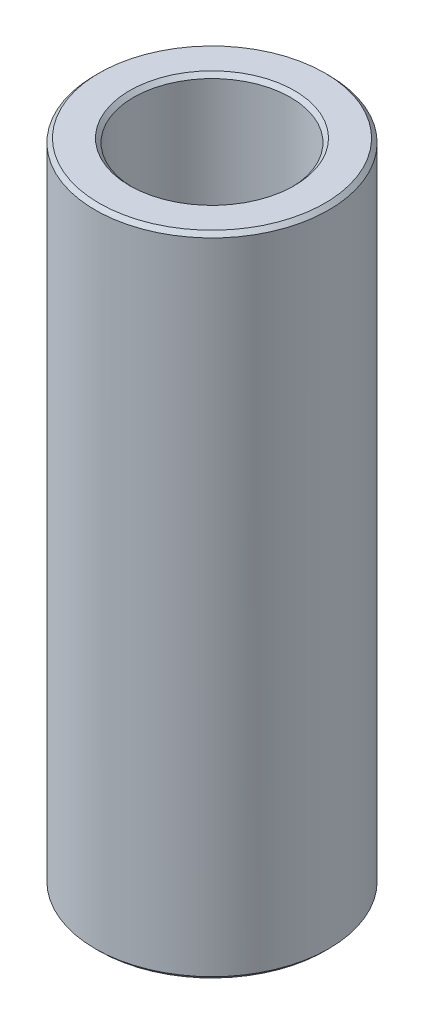
ISO-10303-21;
HEADER;
FILE_DESCRIPTION(('STEP AP214'),'2;1');
FILE_NAME('part.step','',(''),(''),'','','');
FILE_SCHEMA(('AUTOMOTIVE_DESIGN { 1 0 10303 214 1 1 1 1 }'));
ENDSEC;
DATA;
#1=APPLICATION_CONTEXT('core data for automotive mechanical design processes');
#2=APPLICATION_PROTOCOL_DEFINITION('international standard','automotive_design',2000,#1);
#3=PRODUCT_CONTEXT('',#1,'mechanical');
#4=PRODUCT('Part','Part','',(#3));
#5=PRODUCT_RELATED_PRODUCT_CATEGORY('part','',(#4));
#6=PRODUCT_DEFINITION_FORMATION('','',#4);
#7=PRODUCT_DEFINITION_CONTEXT('part definition',#1,'design');
#8=PRODUCT_DEFINITION('design','',#6,#7);
#9=PRODUCT_DEFINITION_SHAPE('','',#8);
#10=(LENGTH_UNIT() NAMED_UNIT(*) SI_UNIT(.MILLI.,.METRE.));
#11=(NAMED_UNIT(*) PLANE_ANGLE_UNIT() SI_UNIT($,.RADIAN.));
#12=(NAMED_UNIT(*) SI_UNIT($,.STERADIAN.) SOLID_ANGLE_UNIT());
#13=UNCERTAINTY_MEASURE_WITH_UNIT(LENGTH_MEASURE(1.E-05),#10,'distance_accuracy_value','');
#14=(GEOMETRIC_REPRESENTATION_CONTEXT(3) GLOBAL_UNCERTAINTY_ASSIGNED_CONTEXT((#13)) GLOBAL_UNIT_ASSIGNED_CONTEXT((#10,
#11,#12)) REPRESENTATION_CONTEXT('',''));
#15=CARTESIAN_POINT('',(0.,0.,0.));
#16=DIRECTION('',(0.,0.,1.));
#17=DIRECTION('',(1.,0.,0.));
#18=AXIS2_PLACEMENT_3D('',#15,#16,#17);
#19=CARTESIAN_POINT('',(0.,8.25,0.));
#20=DIRECTION('',(0.,-1.,0.));
#21=DIRECTION('',(0.,0.,-1.));
#22=AXIS2_PLACEMENT_3D('',#19,#20,#21);
#23=CYLINDRICAL_SURFACE('',#22,2.);
#24=CARTESIAN_POINT('',(0.,-8.15000000000055,0.));
#25=DIRECTION('',(0.,-1.,0.));
#26=DIRECTION('',(0.,0.,-1.));
#27=AXIS2_PLACEMENT_3D('',#24,#25,#26);
#28=CIRCLE('',#27,1.99999999989586);
#29=CARTESIAN_POINT('',(0.,-8.15000000000055,-1.99999999989586));
#30=VERTEX_POINT('',#29);
#31=EDGE_CURVE('E30',#30,#30,#28,.T.);
#32=ORIENTED_EDGE('',*,*,#31,.T.);
#33=EDGE_LOOP('',(#32));
#34=FACE_BOUND('',#33,.T.);
#35=CARTESIAN_POINT('',(0.,8.15000000000055,0.));
#36=DIRECTION('',(0.,1.,0.));
#37=DIRECTION('',(0.,0.,1.));
#38=AXIS2_PLACEMENT_3D('',#35,#36,#37);
#39=CIRCLE('',#38,2.00000000000955);
#40=CARTESIAN_POINT('',(0.,8.15000000000055,2.00000000000955));
#41=VERTEX_POINT('',#40);
#42=EDGE_CURVE('E33',#41,#41,#39,.T.);
#43=ORIENTED_EDGE('',*,*,#42,.T.);
#44=EDGE_LOOP('',(#43));
#45=FACE_BOUND('',#44,.T.);
#46=ADVANCED_FACE('F15',(#34,#45),#23,.F.);
#47=CARTESIAN_POINT('',(0.,8.2499999999186,0.));
#48=DIRECTION('',(0.,1.,0.));
#49=DIRECTION('',(0.,0.,1.));
#50=AXIS2_PLACEMENT_3D('',#47,#48,#49);
#51=CONICAL_SURFACE('',#50,2.0999999999276,0.785398163397448);
#52=ORIENTED_EDGE('',*,*,#42,.F.);
#53=EDGE_LOOP('',(#52));
#54=FACE_BOUND('',#53,.T.);
#55=CARTESIAN_POINT('',(0.,8.25000000003229,0.));
#56=DIRECTION('',(0.,1.,0.));
#57=DIRECTION('',(0.,0.,1.));
#58=AXIS2_PLACEMENT_3D('',#55,#56,#57);
#59=CIRCLE('',#58,2.10000000004129);
#60=CARTESIAN_POINT('',(0.,8.25000000003229,2.10000000004129));
#61=VERTEX_POINT('',#60);
#62=EDGE_CURVE('E18',#61,#61,#59,.F.);
#63=ORIENTED_EDGE('',*,*,#62,.F.);
#64=EDGE_LOOP('',(#63));
#65=FACE_BOUND('',#64,.T.);
#66=ADVANCED_FACE('F50',(#54,#65),#51,.F.);
#67=CARTESIAN_POINT('',(0.,-8.2499999999186,0.));
#68=DIRECTION('',(0.,-1.,0.));
#69=DIRECTION('',(0.,0.,-1.));
#70=AXIS2_PLACEMENT_3D('',#67,#68,#69);
#71=CONICAL_SURFACE('',#70,2.09999999987076,0.785398163681665);
#72=CARTESIAN_POINT('',(0.,-8.24999999997544,0.));
#73=DIRECTION('',(0.,-1.,0.));
#74=DIRECTION('',(0.,0.,-1.));
#75=AXIS2_PLACEMENT_3D('',#72,#73,#74);
#76=CIRCLE('',#75,2.0999999999276);
#77=CARTESIAN_POINT('',(0.,-8.24999999997544,-2.0999999999276));
#78=VERTEX_POINT('',#77);
#79=EDGE_CURVE('E40',#78,#78,#76,.T.);
#80=ORIENTED_EDGE('',*,*,#79,.T.);
#81=EDGE_LOOP('',(#80));
#82=FACE_BOUND('',#81,.T.);
#83=ORIENTED_EDGE('',*,*,#31,.F.);
#84=EDGE_LOOP('',(#83));
#85=FACE_BOUND('',#84,.T.);
#86=ADVANCED_FACE('F52',(#82,#85),#71,.F.);
#87=CARTESIAN_POINT('',(0.,8.25,0.));
#88=DIRECTION('',(0.,1.,0.));
#89=DIRECTION('',(0.,0.,1.));
#90=AXIS2_PLACEMENT_3D('',#87,#88,#89);
#91=PLANE('',#90);
#92=ORIENTED_EDGE('',*,*,#62,.T.);
#93=EDGE_LOOP('',(#92));
#94=FACE_BOUND('',#93,.T.);
#95=CARTESIAN_POINT('',(0.,8.24999999997544,0.));
#96=DIRECTION('',(0.,-1.,0.));
#97=DIRECTION('',(0.,0.,-1.));
#98=AXIS2_PLACEMENT_3D('',#95,#96,#97);
#99=CIRCLE('',#98,2.87500000007412);
#100=CARTESIAN_POINT('',(0.,8.24999999997544,-2.87500000007412));
#101=VERTEX_POINT('',#100);
#102=EDGE_CURVE('E38',#101,#101,#99,.T.);
#103=ORIENTED_EDGE('',*,*,#102,.F.);
#104=EDGE_LOOP('',(#103));
#105=FACE_BOUND('',#104,.T.);
#106=ADVANCED_FACE('F47',(#94,#105),#91,.T.);
#107=CARTESIAN_POINT('',(0.,-8.25,0.));
#108=DIRECTION('',(0.,1.,0.));
#109=DIRECTION('',(0.,0.,1.));
#110=AXIS2_PLACEMENT_3D('',#107,#108,#109);
#111=PLANE('',#110);
#112=ORIENTED_EDGE('',*,*,#79,.F.);
#113=EDGE_LOOP('',(#112));
#114=FACE_BOUND('',#113,.T.);
#115=CARTESIAN_POINT('',(0.,-8.25000000003229,0.));
#116=DIRECTION('',(0.,1.,0.));
#117=DIRECTION('',(0.,0.,1.));
#118=AXIS2_PLACEMENT_3D('',#115,#116,#117);
#119=CIRCLE('',#118,2.87499999996044);
#120=CARTESIAN_POINT('',(0.,-8.25000000003229,2.87499999996044));
#121=VERTEX_POINT('',#120);
#122=EDGE_CURVE('E27',#121,#121,#119,.T.);
#123=ORIENTED_EDGE('',*,*,#122,.F.);
#124=EDGE_LOOP('',(#123));
#125=FACE_BOUND('',#124,.T.);
#126=ADVANCED_FACE('F76',(#114,#125),#111,.F.);
#127=CARTESIAN_POINT('',(0.,8.15000000005739,0.));
#128=DIRECTION('',(0.,-1.,0.));
#129=DIRECTION('',(0.,0.,-1.));
#130=AXIS2_PLACEMENT_3D('',#127,#128,#129);
#131=CONICAL_SURFACE('',#130,2.97499999999218,0.785398163397448);
#132=CARTESIAN_POINT('',(0.,8.15,0.));
#133=DIRECTION('',(0.,-1.,0.));
#134=DIRECTION('',(0.,0.,-1.));
#135=AXIS2_PLACEMENT_3D('',#132,#133,#134);
#136=CIRCLE('',#135,2.975);
#137=CARTESIAN_POINT('',(0.,8.15,-2.975));
#138=VERTEX_POINT('',#137);
#139=EDGE_CURVE('E22',#138,#138,#136,.T.);
#140=ORIENTED_EDGE('',*,*,#139,.F.);
#141=EDGE_LOOP('',(#140));
#142=FACE_BOUND('',#141,.T.);
#143=ORIENTED_EDGE('',*,*,#102,.T.);
#144=EDGE_LOOP('',(#143));
#145=FACE_BOUND('',#144,.T.);
#146=ADVANCED_FACE('F69',(#142,#145),#131,.T.);
#147=CARTESIAN_POINT('',(0.,-8.15000000005739,0.));
#148=DIRECTION('',(0.,1.,0.));
#149=DIRECTION('',(0.,0.,1.));
#150=AXIS2_PLACEMENT_3D('',#147,#148,#149);
#151=CONICAL_SURFACE('',#150,2.97499999993533,0.785398163397448);
#152=CARTESIAN_POINT('',(0.,-8.15,0.));
#153=DIRECTION('',(0.,-1.,0.));
#154=DIRECTION('',(0.,0.,-1.));
#155=AXIS2_PLACEMENT_3D('',#152,#153,#154);
#156=CIRCLE('',#155,2.975);
#157=CARTESIAN_POINT('',(0.,-8.15,-2.975));
#158=VERTEX_POINT('',#157);
#159=EDGE_CURVE('E10',#158,#158,#156,.F.);
#160=ORIENTED_EDGE('',*,*,#159,.F.);
#161=EDGE_LOOP('',(#160));
#162=FACE_BOUND('',#161,.T.);
#163=ORIENTED_EDGE('',*,*,#122,.T.);
#164=EDGE_LOOP('',(#163));
#165=FACE_BOUND('',#164,.T.);
#166=ADVANCED_FACE('F64',(#162,#165),#151,.T.);
#167=CARTESIAN_POINT('',(0.,8.25,0.));
#168=DIRECTION('',(0.,-1.,0.));
#169=DIRECTION('',(0.,0.,-1.));
#170=AXIS2_PLACEMENT_3D('',#167,#168,#169);
#171=CYLINDRICAL_SURFACE('',#170,2.975);
#172=ORIENTED_EDGE('',*,*,#159,.T.);
#173=EDGE_LOOP('',(#172));
#174=FACE_BOUND('',#173,.T.);
#175=ORIENTED_EDGE('',*,*,#139,.T.);
#176=EDGE_LOOP('',(#175));
#177=FACE_BOUND('',#176,.T.);
#178=ADVANCED_FACE('F62',(#174,#177),#171,.T.);
#179=CLOSED_SHELL('',(#46,#66,#86,#106,#126,#146,#166,#178));
#180=MANIFOLD_SOLID_BREP('B1',#179);
#181=ADVANCED_BREP_SHAPE_REPRESENTATION('',(#18,#180),#14);
#182=SHAPE_DEFINITION_REPRESENTATION(#9,#181);
ENDSEC;
END-ISO-10303-21;
